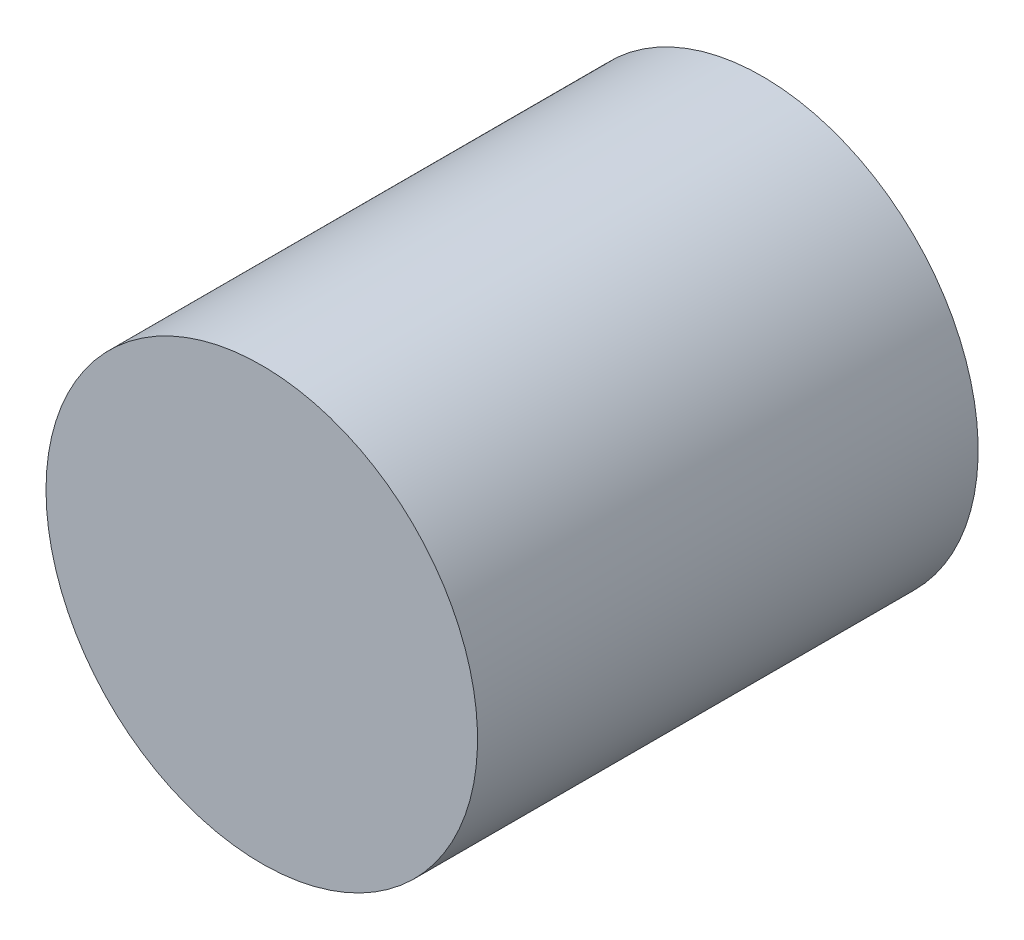
ISO-10303-21;
HEADER;
FILE_DESCRIPTION(('STEP AP214'),'2;1');
FILE_NAME('part.step','',(''),(''),'','','');
FILE_SCHEMA(('AUTOMOTIVE_DESIGN { 1 0 10303 214 1 1 1 1 }'));
ENDSEC;
DATA;
#1=APPLICATION_CONTEXT('core data for automotive mechanical design processes');
#2=APPLICATION_PROTOCOL_DEFINITION('international standard','automotive_design',2000,#1);
#3=PRODUCT_CONTEXT('',#1,'mechanical');
#4=PRODUCT('Part','Part','',(#3));
#5=PRODUCT_RELATED_PRODUCT_CATEGORY('part','',(#4));
#6=PRODUCT_DEFINITION_FORMATION('','',#4);
#7=PRODUCT_DEFINITION_CONTEXT('part definition',#1,'design');
#8=PRODUCT_DEFINITION('design','',#6,#7);
#9=PRODUCT_DEFINITION_SHAPE('','',#8);
#10=(LENGTH_UNIT() NAMED_UNIT(*) SI_UNIT(.MILLI.,.METRE.));
#11=(NAMED_UNIT(*) PLANE_ANGLE_UNIT() SI_UNIT($,.RADIAN.));
#12=(NAMED_UNIT(*) SI_UNIT($,.STERADIAN.) SOLID_ANGLE_UNIT());
#13=UNCERTAINTY_MEASURE_WITH_UNIT(LENGTH_MEASURE(1.E-05),#10,'distance_accuracy_value','');
#14=(GEOMETRIC_REPRESENTATION_CONTEXT(3) GLOBAL_UNCERTAINTY_ASSIGNED_CONTEXT((#13)) GLOBAL_UNIT_ASSIGNED_CONTEXT((#10,
#11,#12)) REPRESENTATION_CONTEXT('',''));
#15=CARTESIAN_POINT('',(0.,0.,0.));
#16=DIRECTION('',(0.,0.,1.));
#17=DIRECTION('',(1.,0.,0.));
#18=AXIS2_PLACEMENT_3D('',#15,#16,#17);
#19=CARTESIAN_POINT('',(0.,0.,29.));
#20=DIRECTION('',(0.,0.,-1.));
#21=DIRECTION('',(-1.,0.,0.));
#22=AXIS2_PLACEMENT_3D('',#19,#20,#21);
#23=CYLINDRICAL_SURFACE('',#22,12.5);
#24=CARTESIAN_POINT('',(0.,0.,29.));
#25=DIRECTION('',(0.,0.,1.));
#26=DIRECTION('',(1.,0.,0.));
#27=AXIS2_PLACEMENT_3D('',#24,#25,#26);
#28=CIRCLE('',#27,12.5);
#29=CARTESIAN_POINT('',(-12.5,0.,29.));
#30=VERTEX_POINT('',#29);
#31=EDGE_CURVE('E10',#30,#30,#28,.T.);
#32=CARTESIAN_POINT('',(0.,0.,0.));
#33=DIRECTION('',(0.,0.,1.));
#34=DIRECTION('',(1.,0.,0.));
#35=AXIS2_PLACEMENT_3D('',#32,#33,#34);
#36=CIRCLE('',#35,12.5);
#37=CARTESIAN_POINT('',(-12.5,0.,0.));
#38=VERTEX_POINT('',#37);
#39=EDGE_CURVE('E34',#38,#38,#36,.T.);
#40=CARTESIAN_POINT('',(-12.5,0.,29.));
#41=CARTESIAN_POINT('',(-12.5,0.,28.6979166666667));
#42=CARTESIAN_POINT('',(-12.5,0.,28.3958333333333));
#43=CARTESIAN_POINT('',(-12.5,0.,27.7916666666667));
#44=CARTESIAN_POINT('',(-12.5,0.,27.4895833333333));
#45=CARTESIAN_POINT('',(-12.5,0.,26.8854166666667));
#46=CARTESIAN_POINT('',(-12.5,0.,26.5833333333333));
#47=CARTESIAN_POINT('',(-12.5,0.,25.9791666666667));
#48=CARTESIAN_POINT('',(-12.5,0.,25.6770833333333));
#49=CARTESIAN_POINT('',(-12.5,0.,25.0729166666667));
#50=CARTESIAN_POINT('',(-12.5,0.,24.7708333333333));
#51=CARTESIAN_POINT('',(-12.5,0.,24.1666666666667));
#52=CARTESIAN_POINT('',(-12.5,0.,23.8645833333333));
#53=CARTESIAN_POINT('',(-12.5,0.,23.2604166666667));
#54=CARTESIAN_POINT('',(-12.5,0.,22.9583333333333));
#55=CARTESIAN_POINT('',(-12.5,0.,22.3541666666667));
#56=CARTESIAN_POINT('',(-12.5,0.,22.0520833333333));
#57=CARTESIAN_POINT('',(-12.5,0.,21.4479166666667));
#58=CARTESIAN_POINT('',(-12.5,0.,21.1458333333333));
#59=CARTESIAN_POINT('',(-12.5,0.,20.5416666666667));
#60=CARTESIAN_POINT('',(-12.5,0.,20.2395833333333));
#61=CARTESIAN_POINT('',(-12.5,0.,19.6354166666667));
#62=CARTESIAN_POINT('',(-12.5,0.,19.3333333333333));
#63=CARTESIAN_POINT('',(-12.5,0.,18.7291666666667));
#64=CARTESIAN_POINT('',(-12.5,0.,18.4270833333333));
#65=CARTESIAN_POINT('',(-12.5,0.,17.8229166666667));
#66=CARTESIAN_POINT('',(-12.5,0.,17.5208333333333));
#67=CARTESIAN_POINT('',(-12.5,0.,16.9166666666667));
#68=CARTESIAN_POINT('',(-12.5,0.,16.6145833333333));
#69=CARTESIAN_POINT('',(-12.5,0.,16.0104166666667));
#70=CARTESIAN_POINT('',(-12.5,0.,15.7083333333333));
#71=CARTESIAN_POINT('',(-12.5,0.,15.1041666666667));
#72=CARTESIAN_POINT('',(-12.5,0.,14.8020833333333));
#73=CARTESIAN_POINT('',(-12.5,0.,14.1979166666667));
#74=CARTESIAN_POINT('',(-12.5,0.,13.8958333333333));
#75=CARTESIAN_POINT('',(-12.5,0.,13.2916666666667));
#76=CARTESIAN_POINT('',(-12.5,0.,12.9895833333333));
#77=CARTESIAN_POINT('',(-12.5,0.,12.3854166666667));
#78=CARTESIAN_POINT('',(-12.5,0.,12.0833333333333));
#79=CARTESIAN_POINT('',(-12.5,0.,11.4791666666667));
#80=CARTESIAN_POINT('',(-12.5,0.,11.1770833333333));
#81=CARTESIAN_POINT('',(-12.5,0.,10.5729166666667));
#82=CARTESIAN_POINT('',(-12.5,0.,10.2708333333333));
#83=CARTESIAN_POINT('',(-12.5,0.,9.66666666666667));
#84=CARTESIAN_POINT('',(-12.5,0.,9.36458333333333));
#85=CARTESIAN_POINT('',(-12.5,0.,8.76041666666667));
#86=CARTESIAN_POINT('',(-12.5,0.,8.45833333333333));
#87=CARTESIAN_POINT('',(-12.5,0.,7.85416666666667));
#88=CARTESIAN_POINT('',(-12.5,0.,7.55208333333333));
#89=CARTESIAN_POINT('',(-12.5,0.,6.94791666666667));
#90=CARTESIAN_POINT('',(-12.5,0.,6.64583333333333));
#91=CARTESIAN_POINT('',(-12.5,0.,6.04166666666667));
#92=CARTESIAN_POINT('',(-12.5,0.,5.73958333333333));
#93=CARTESIAN_POINT('',(-12.5,0.,5.13541666666667));
#94=CARTESIAN_POINT('',(-12.5,0.,4.83333333333333));
#95=CARTESIAN_POINT('',(-12.5,0.,4.22916666666667));
#96=CARTESIAN_POINT('',(-12.5,0.,3.92708333333333));
#97=CARTESIAN_POINT('',(-12.5,0.,3.32291666666667));
#98=CARTESIAN_POINT('',(-12.5,0.,3.02083333333333));
#99=CARTESIAN_POINT('',(-12.5,0.,2.41666666666667));
#100=CARTESIAN_POINT('',(-12.5,0.,2.11458333333333));
#101=CARTESIAN_POINT('',(-12.5,0.,1.51041666666667));
#102=CARTESIAN_POINT('',(-12.5,0.,1.20833333333333));
#103=CARTESIAN_POINT('',(-12.5,0.,0.604166666666667));
#104=CARTESIAN_POINT('',(-12.5,0.,0.302083333333333));
#105=CARTESIAN_POINT('',(-12.5,0.,0.));
#106=B_SPLINE_CURVE_WITH_KNOTS('',3,(#40,#41,#42,#43,#44,#45,#46,#47,#48,#49,#50,#51,#52,#53,
#54,#55,#56,#57,#58,#59,#60,#61,#62,#63,#64,#65,#66,#67,#68,#69,#70,#71,#72,#73,#74,#75,#76,#77,
#78,#79,#80,#81,#82,#83,#84,#85,#86,#87,#88,#89,#90,#91,#92,#93,#94,#95,#96,#97,#98,#99,#100,
#101,#102,#103,#104,#105),.UNSPECIFIED.,.F.,.F.,(4,2,2,2,2,2,2,2,2,2,2,2,2,2,2,2,2,2,2,2,2,2,2,
2,2,2,2,2,2,2,2,2,4),(0.,0.906250000000001,1.8125,2.71875,3.625,4.53125,5.4375,6.34375,7.25,
8.15625,9.0625,9.96875,10.875,11.78125,12.6875,13.59375,14.5,15.40625,16.3125,17.21875,18.125,
19.03125,19.9375,20.84375,21.75,22.65625,23.5625,24.46875,25.375,26.28125,27.1875,28.09375,29.),.UNSPECIFIED.);
#107=EDGE_CURVE('BSEAM31',#30,#38,#106,.T.);
#108=ORIENTED_EDGE('',*,*,#31,.F.);
#109=ORIENTED_EDGE('',*,*,#39,.T.);
#110=ORIENTED_EDGE('',*,*,#107,.T.);
#111=ORIENTED_EDGE('',*,*,#107,.F.);
#112=EDGE_LOOP('',(#108,#110,#109,#111));
#113=FACE_BOUND('',#112,.T.);
#114=ADVANCED_FACE('F31',(#113),#23,.T.);
#115=CARTESIAN_POINT('',(0.,0.,29.));
#116=DIRECTION('',(0.,0.,1.));
#117=DIRECTION('',(1.,0.,0.));
#118=AXIS2_PLACEMENT_3D('',#115,#116,#117);
#119=PLANE('',#118);
#120=ORIENTED_EDGE('',*,*,#31,.T.);
#121=EDGE_LOOP('',(#120));
#122=FACE_BOUND('',#121,.T.);
#123=ADVANCED_FACE('F46',(#122),#119,.T.);
#124=CARTESIAN_POINT('',(0.,0.,0.));
#125=DIRECTION('',(0.,0.,1.));
#126=DIRECTION('',(1.,0.,0.));
#127=AXIS2_PLACEMENT_3D('',#124,#125,#126);
#128=PLANE('',#127);
#129=ORIENTED_EDGE('',*,*,#39,.F.);
#130=EDGE_LOOP('',(#129));
#131=FACE_BOUND('',#130,.T.);
#132=ADVANCED_FACE('F44',(#131),#128,.F.);
#133=CLOSED_SHELL('',(#114,#123,#132));
#134=MANIFOLD_SOLID_BREP('B2',#133);
#135=ADVANCED_BREP_SHAPE_REPRESENTATION('',(#18,#134),#14);
#136=SHAPE_DEFINITION_REPRESENTATION(#9,#135);
ENDSEC;
END-ISO-10303-21;
